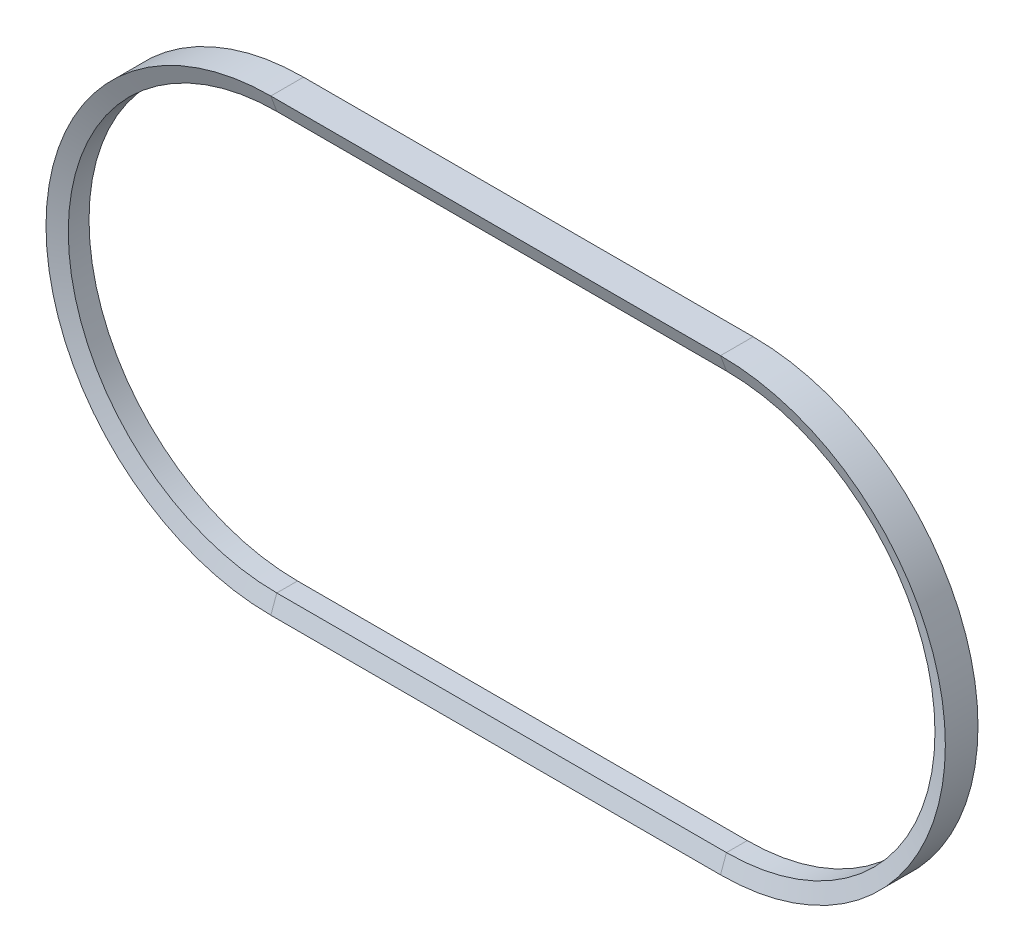
ISO-10303-21;
HEADER;
FILE_DESCRIPTION(('STEP AP214'),'2;1');
FILE_NAME('part.step','',(''),(''),'','','');
FILE_SCHEMA(('AUTOMOTIVE_DESIGN { 1 0 10303 214 1 1 1 1 }'));
ENDSEC;
DATA;
#1=APPLICATION_CONTEXT('core data for automotive mechanical design processes');
#2=APPLICATION_PROTOCOL_DEFINITION('international standard','automotive_design',2000,#1);
#3=PRODUCT_CONTEXT('',#1,'mechanical');
#4=PRODUCT('Part','Part','',(#3));
#5=PRODUCT_RELATED_PRODUCT_CATEGORY('part','',(#4));
#6=PRODUCT_DEFINITION_FORMATION('','',#4);
#7=PRODUCT_DEFINITION_CONTEXT('part definition',#1,'design');
#8=PRODUCT_DEFINITION('design','',#6,#7);
#9=PRODUCT_DEFINITION_SHAPE('','',#8);
#10=(LENGTH_UNIT() NAMED_UNIT(*) SI_UNIT(.MILLI.,.METRE.));
#11=(NAMED_UNIT(*) PLANE_ANGLE_UNIT() SI_UNIT($,.RADIAN.));
#12=(NAMED_UNIT(*) SI_UNIT($,.STERADIAN.) SOLID_ANGLE_UNIT());
#13=UNCERTAINTY_MEASURE_WITH_UNIT(LENGTH_MEASURE(1.E-05),#10,'distance_accuracy_value','');
#14=(GEOMETRIC_REPRESENTATION_CONTEXT(3) GLOBAL_UNCERTAINTY_ASSIGNED_CONTEXT((#13)) GLOBAL_UNIT_ASSIGNED_CONTEXT((#10,
#11,#12)) REPRESENTATION_CONTEXT('',''));
#15=CARTESIAN_POINT('',(0.,0.,0.));
#16=DIRECTION('',(0.,0.,1.));
#17=DIRECTION('',(1.,0.,0.));
#18=AXIS2_PLACEMENT_3D('',#15,#16,#17);
#19=CARTESIAN_POINT('',(0.,41.9908799755386,-3.048));
#20=DIRECTION('',(0.,-1.,0.));
#21=DIRECTION('',(1.,0.,0.));
#22=AXIS2_PLACEMENT_3D('',#19,#20,#21);
#23=PLANE('',#22);
#24=DIRECTION('',(-1.,0.,0.));
#25=VECTOR('',#24,1.);
#26=CARTESIAN_POINT('',(0.,41.9908799755386,3.048));
#27=LINE('',#26,#25);
#28=CARTESIAN_POINT('',(41.9908799755387,41.9908799755384,3.048));
#29=VERTEX_POINT('',#28);
#30=CARTESIAN_POINT('',(-41.9908799755387,41.9908799755386,3.048));
#31=VERTEX_POINT('',#30);
#32=EDGE_CURVE('E141',#29,#31,#27,.T.);
#33=ORIENTED_EDGE('',*,*,#32,.F.);
#34=DIRECTION('',(0.,0.,1.));
#35=VECTOR('',#34,1.);
#36=CARTESIAN_POINT('',(41.9908799755386,41.9908799755384,-3.048));
#37=LINE('',#36,#35);
#38=CARTESIAN_POINT('',(41.9908799755387,41.9908799755384,-3.048));
#39=VERTEX_POINT('',#38);
#40=EDGE_CURVE('E130',#39,#29,#37,.T.);
#41=ORIENTED_EDGE('',*,*,#40,.F.);
#42=DIRECTION('',(-1.,0.,0.));
#43=VECTOR('',#42,1.);
#44=CARTESIAN_POINT('',(0.,41.9908799755386,-3.048));
#45=LINE('',#44,#43);
#46=CARTESIAN_POINT('',(-41.9908799755387,41.9908799755386,-3.048));
#47=VERTEX_POINT('',#46);
#48=EDGE_CURVE('E126',#39,#47,#45,.T.);
#49=ORIENTED_EDGE('',*,*,#48,.T.);
#50=DIRECTION('',(0.,0.,1.));
#51=VECTOR('',#50,1.);
#52=CARTESIAN_POINT('',(-41.9908799755387,41.9908799755386,-3.048));
#53=LINE('',#52,#51);
#54=EDGE_CURVE('E128',#47,#31,#53,.T.);
#55=ORIENTED_EDGE('',*,*,#54,.T.);
#56=EDGE_LOOP('',(#33,#41,#49,#55));
#57=FACE_BOUND('',#56,.T.);
#58=ADVANCED_FACE('F32',(#57),#23,.F.);
#59=CARTESIAN_POINT('',(0.,41.9908799755386,3.048));
#60=DIRECTION('',(0.,0.34202014332567,-0.939692620785908));
#61=DIRECTION('',(0.,0.939692620785908,0.34202014332567));
#62=AXIS2_PLACEMENT_3D('',#59,#60,#61);
#63=PLANE('',#62);
#64=DIRECTION('',(-1.,0.,0.));
#65=VECTOR('',#64,1.);
#66=CARTESIAN_POINT('',(0.,38.9428799755386,1.93861872595661));
#67=LINE('',#66,#65);
#68=CARTESIAN_POINT('',(41.9908799755387,38.9428799755384,1.93861872595661));
#69=VERTEX_POINT('',#68);
#70=CARTESIAN_POINT('',(-41.9908799755387,38.9428799755386,1.93861872595661));
#71=VERTEX_POINT('',#70);
#72=EDGE_CURVE('E56',#69,#71,#67,.T.);
#73=ORIENTED_EDGE('',*,*,#72,.F.);
#74=DIRECTION('',(0.,-0.939692620785908,-0.34202014332567));
#75=VECTOR('',#74,1.);
#76=CARTESIAN_POINT('',(41.9908799755386,41.9908799755384,3.048));
#77=LINE('',#76,#75);
#78=EDGE_CURVE('E168',#29,#69,#77,.T.);
#79=ORIENTED_EDGE('',*,*,#78,.F.);
#80=ORIENTED_EDGE('',*,*,#32,.T.);
#81=DIRECTION('',(0.,-0.939692620785908,-0.34202014332567));
#82=VECTOR('',#81,1.);
#83=CARTESIAN_POINT('',(-41.9908799755387,41.9908799755386,3.048));
#84=LINE('',#83,#82);
#85=EDGE_CURVE('E171',#31,#71,#84,.T.);
#86=ORIENTED_EDGE('',*,*,#85,.T.);
#87=EDGE_LOOP('',(#73,#79,#80,#86));
#88=FACE_BOUND('',#87,.T.);
#89=ADVANCED_FACE('F213',(#88),#63,.F.);
#90=CARTESIAN_POINT('',(0.,38.9428799755386,1.93861872595661));
#91=DIRECTION('',(0.,1.,0.));
#92=DIRECTION('',(-1.,0.,0.));
#93=AXIS2_PLACEMENT_3D('',#90,#91,#92);
#94=PLANE('',#93);
#95=DIRECTION('',(-1.,0.,0.));
#96=VECTOR('',#95,1.);
#97=CARTESIAN_POINT('',(0.,38.9428799755386,-1.93861872595661));
#98=LINE('',#97,#96);
#99=CARTESIAN_POINT('',(41.9908799755387,38.9428799755384,-1.93861872595661));
#100=VERTEX_POINT('',#99);
#101=CARTESIAN_POINT('',(-41.9908799755387,38.9428799755386,-1.93861872595661));
#102=VERTEX_POINT('',#101);
#103=EDGE_CURVE('E47',#100,#102,#98,.T.);
#104=ORIENTED_EDGE('',*,*,#103,.F.);
#105=DIRECTION('',(0.,0.,-1.));
#106=VECTOR('',#105,1.);
#107=CARTESIAN_POINT('',(41.9908799755386,38.9428799755384,1.93861872595661));
#108=LINE('',#107,#106);
#109=EDGE_CURVE('E186',#69,#100,#108,.T.);
#110=ORIENTED_EDGE('',*,*,#109,.F.);
#111=ORIENTED_EDGE('',*,*,#72,.T.);
#112=DIRECTION('',(0.,0.,-1.));
#113=VECTOR('',#112,1.);
#114=CARTESIAN_POINT('',(-41.9908799755387,38.9428799755386,1.93861872595661));
#115=LINE('',#114,#113);
#116=EDGE_CURVE('E174',#71,#102,#115,.T.);
#117=ORIENTED_EDGE('',*,*,#116,.T.);
#118=EDGE_LOOP('',(#104,#110,#111,#117));
#119=FACE_BOUND('',#118,.T.);
#120=ADVANCED_FACE('F212',(#119),#94,.F.);
#121=CARTESIAN_POINT('',(0.,41.9908799755386,-3.048));
#122=DIRECTION('',(0.,0.34202014332567,0.939692620785908));
#123=DIRECTION('',(0.,-0.939692620785908,0.34202014332567));
#124=AXIS2_PLACEMENT_3D('',#121,#122,#123);
#125=PLANE('',#124);
#126=DIRECTION('',(0.,0.939692620785908,-0.34202014332567));
#127=VECTOR('',#126,1.);
#128=CARTESIAN_POINT('',(-41.9908799755387,41.9908799755386,-3.048));
#129=LINE('',#128,#127);
#130=EDGE_CURVE('E144',#102,#47,#129,.T.);
#131=ORIENTED_EDGE('',*,*,#130,.T.);
#132=ORIENTED_EDGE('',*,*,#48,.F.);
#133=DIRECTION('',(0.,0.939692620785908,-0.34202014332567));
#134=VECTOR('',#133,1.);
#135=CARTESIAN_POINT('',(41.9908799755386,41.9908799755384,-3.048));
#136=LINE('',#135,#134);
#137=EDGE_CURVE('E11',#100,#39,#136,.T.);
#138=ORIENTED_EDGE('',*,*,#137,.F.);
#139=ORIENTED_EDGE('',*,*,#103,.T.);
#140=EDGE_LOOP('',(#131,#132,#138,#139));
#141=FACE_BOUND('',#140,.T.);
#142=ADVANCED_FACE('F145',(#141),#125,.F.);
#143=CARTESIAN_POINT('',(-41.9908799755387,0.,0.));
#144=DIRECTION('',(0.,0.,1.));
#145=DIRECTION('',(1.,0.,0.));
#146=AXIS2_PLACEMENT_3D('',#143,#144,#145);
#147=CYLINDRICAL_SURFACE('',#146,41.9908799755386);
#148=CARTESIAN_POINT('',(-41.9908799755387,0.,3.048));
#149=DIRECTION('',(0.,0.,1.));
#150=DIRECTION('',(0.,1.,0.));
#151=AXIS2_PLACEMENT_3D('',#148,#149,#150);
#152=CIRCLE('',#151,41.9908799755386);
#153=CARTESIAN_POINT('',(-41.9908799755387,-41.9908799755387,3.048));
#154=VERTEX_POINT('',#153);
#155=EDGE_CURVE('E114',#31,#154,#152,.T.);
#156=ORIENTED_EDGE('',*,*,#155,.F.);
#157=ORIENTED_EDGE('',*,*,#54,.F.);
#158=CARTESIAN_POINT('',(-41.9908799755387,0.,-3.048));
#159=DIRECTION('',(0.,0.,1.));
#160=DIRECTION('',(0.,1.,0.));
#161=AXIS2_PLACEMENT_3D('',#158,#159,#160);
#162=CIRCLE('',#161,41.9908799755386);
#163=CARTESIAN_POINT('',(-41.9908799755387,-41.9908799755387,-3.048));
#164=VERTEX_POINT('',#163);
#165=EDGE_CURVE('E139',#47,#164,#162,.T.);
#166=ORIENTED_EDGE('',*,*,#165,.T.);
#167=DIRECTION('',(0.,0.,1.));
#168=VECTOR('',#167,1.);
#169=CARTESIAN_POINT('',(-41.9908799755387,-41.9908799755387,-3.048));
#170=LINE('',#169,#168);
#171=EDGE_CURVE('E152',#164,#154,#170,.T.);
#172=ORIENTED_EDGE('',*,*,#171,.T.);
#173=EDGE_LOOP('',(#156,#157,#166,#172));
#174=FACE_BOUND('',#173,.T.);
#175=ADVANCED_FACE('F137',(#174),#147,.T.);
#176=CARTESIAN_POINT('',(-41.9908799755387,0.,3.048));
#177=DIRECTION('',(0.,0.,1.));
#178=DIRECTION('',(1.,0.,0.));
#179=AXIS2_PLACEMENT_3D('',#176,#177,#178);
#180=CONICAL_SURFACE('',#179,41.9908799755386,1.22173047639603);
#181=CARTESIAN_POINT('',(-41.9908799755387,0.,1.93861872595661));
#182=DIRECTION('',(0.,0.,1.));
#183=DIRECTION('',(0.,1.,0.));
#184=AXIS2_PLACEMENT_3D('',#181,#182,#183);
#185=CIRCLE('',#184,38.9428799755386);
#186=CARTESIAN_POINT('',(-41.9908799755387,-38.9428799755387,1.93861872595661));
#187=VERTEX_POINT('',#186);
#188=EDGE_CURVE('E108',#71,#187,#185,.T.);
#189=ORIENTED_EDGE('',*,*,#188,.F.);
#190=ORIENTED_EDGE('',*,*,#85,.F.);
#191=ORIENTED_EDGE('',*,*,#155,.T.);
#192=DIRECTION('',(0.,0.939692620785908,-0.34202014332567));
#193=VECTOR('',#192,1.);
#194=CARTESIAN_POINT('',(-41.9908799755387,-41.9908799755387,3.048));
#195=LINE('',#194,#193);
#196=EDGE_CURVE('E175',#154,#187,#195,.T.);
#197=ORIENTED_EDGE('',*,*,#196,.T.);
#198=EDGE_LOOP('',(#189,#190,#191,#197));
#199=FACE_BOUND('',#198,.T.);
#200=ADVANCED_FACE('F209',(#199),#180,.F.);
#201=CARTESIAN_POINT('',(-41.9908799755387,0.,0.));
#202=DIRECTION('',(0.,0.,1.));
#203=DIRECTION('',(1.,0.,0.));
#204=AXIS2_PLACEMENT_3D('',#201,#202,#203);
#205=CYLINDRICAL_SURFACE('',#204,38.9428799755386);
#206=CARTESIAN_POINT('',(-41.9908799755387,0.,-1.93861872595661));
#207=DIRECTION('',(0.,0.,1.));
#208=DIRECTION('',(0.,1.,0.));
#209=AXIS2_PLACEMENT_3D('',#206,#207,#208);
#210=CIRCLE('',#209,38.9428799755386);
#211=CARTESIAN_POINT('',(-41.9908799755387,-38.9428799755387,-1.93861872595661));
#212=VERTEX_POINT('',#211);
#213=EDGE_CURVE('E190',#102,#212,#210,.T.);
#214=ORIENTED_EDGE('',*,*,#213,.F.);
#215=ORIENTED_EDGE('',*,*,#116,.F.);
#216=ORIENTED_EDGE('',*,*,#188,.T.);
#217=DIRECTION('',(0.,0.,-1.));
#218=VECTOR('',#217,1.);
#219=CARTESIAN_POINT('',(-41.9908799755387,-38.9428799755387,1.93861872595661));
#220=LINE('',#219,#218);
#221=EDGE_CURVE('E178',#187,#212,#220,.T.);
#222=ORIENTED_EDGE('',*,*,#221,.T.);
#223=EDGE_LOOP('',(#214,#215,#216,#222));
#224=FACE_BOUND('',#223,.T.);
#225=ADVANCED_FACE('F211',(#224),#205,.F.);
#226=CARTESIAN_POINT('',(-41.9908799755387,0.,-1.93861872595661));
#227=DIRECTION('',(0.,0.,-1.));
#228=DIRECTION('',(-1.,0.,0.));
#229=AXIS2_PLACEMENT_3D('',#226,#227,#228);
#230=CONICAL_SURFACE('',#229,38.9428799755386,1.22173047639603);
#231=DIRECTION('',(0.,-0.939692620785908,-0.34202014332567));
#232=VECTOR('',#231,1.);
#233=CARTESIAN_POINT('',(-41.9908799755387,-41.9908799755387,-3.048));
#234=LINE('',#233,#232);
#235=EDGE_CURVE('E150',#212,#164,#234,.T.);
#236=ORIENTED_EDGE('',*,*,#235,.T.);
#237=ORIENTED_EDGE('',*,*,#165,.F.);
#238=ORIENTED_EDGE('',*,*,#130,.F.);
#239=ORIENTED_EDGE('',*,*,#213,.T.);
#240=EDGE_LOOP('',(#236,#237,#238,#239));
#241=FACE_BOUND('',#240,.T.);
#242=ADVANCED_FACE('F149',(#241),#230,.F.);
#243=CARTESIAN_POINT('',(-41.9908799755387,-41.9908799755387,-3.048));
#244=DIRECTION('',(0.,1.,0.));
#245=DIRECTION('',(-1.,0.,0.));
#246=AXIS2_PLACEMENT_3D('',#243,#244,#245);
#247=PLANE('',#246);
#248=DIRECTION('',(1.,0.,0.));
#249=VECTOR('',#248,1.);
#250=CARTESIAN_POINT('',(-41.9908799755387,-41.9908799755387,3.048));
#251=LINE('',#250,#249);
#252=CARTESIAN_POINT('',(41.9908799755387,-41.9908799755386,3.048));
#253=VERTEX_POINT('',#252);
#254=EDGE_CURVE('E95',#154,#253,#251,.T.);
#255=ORIENTED_EDGE('',*,*,#254,.F.);
#256=ORIENTED_EDGE('',*,*,#171,.F.);
#257=DIRECTION('',(1.,0.,0.));
#258=VECTOR('',#257,1.);
#259=CARTESIAN_POINT('',(-41.9908799755387,-41.9908799755387,-3.048));
#260=LINE('',#259,#258);
#261=CARTESIAN_POINT('',(41.9908799755387,-41.9908799755386,-3.048));
#262=VERTEX_POINT('',#261);
#263=EDGE_CURVE('E161',#164,#262,#260,.T.);
#264=ORIENTED_EDGE('',*,*,#263,.T.);
#265=DIRECTION('',(0.,0.,1.));
#266=VECTOR('',#265,1.);
#267=CARTESIAN_POINT('',(41.9908799755387,-41.9908799755386,-3.048));
#268=LINE('',#267,#266);
#269=EDGE_CURVE('E157',#262,#253,#268,.T.);
#270=ORIENTED_EDGE('',*,*,#269,.T.);
#271=EDGE_LOOP('',(#255,#256,#264,#270));
#272=FACE_BOUND('',#271,.T.);
#273=ADVANCED_FACE('F207',(#272),#247,.F.);
#274=CARTESIAN_POINT('',(-41.9908799755387,-41.9908799755387,3.048));
#275=DIRECTION('',(0.,-0.34202014332567,-0.939692620785908));
#276=DIRECTION('',(0.,0.939692620785908,-0.34202014332567));
#277=AXIS2_PLACEMENT_3D('',#274,#275,#276);
#278=PLANE('',#277);
#279=DIRECTION('',(1.,0.,0.));
#280=VECTOR('',#279,1.);
#281=CARTESIAN_POINT('',(-41.9908799755387,-38.9428799755387,1.93861872595661));
#282=LINE('',#281,#280);
#283=CARTESIAN_POINT('',(41.9908799755387,-38.9428799755386,1.93861872595661));
#284=VERTEX_POINT('',#283);
#285=EDGE_CURVE('E88',#187,#284,#282,.T.);
#286=ORIENTED_EDGE('',*,*,#285,.F.);
#287=ORIENTED_EDGE('',*,*,#196,.F.);
#288=ORIENTED_EDGE('',*,*,#254,.T.);
#289=DIRECTION('',(0.,0.939692620785908,-0.34202014332567));
#290=VECTOR('',#289,1.);
#291=CARTESIAN_POINT('',(41.9908799755387,-41.9908799755386,3.048));
#292=LINE('',#291,#290);
#293=EDGE_CURVE('E159',#253,#284,#292,.T.);
#294=ORIENTED_EDGE('',*,*,#293,.T.);
#295=EDGE_LOOP('',(#286,#287,#288,#294));
#296=FACE_BOUND('',#295,.T.);
#297=ADVANCED_FACE('F208',(#296),#278,.F.);
#298=CARTESIAN_POINT('',(-41.9908799755387,-38.9428799755387,1.93861872595661));
#299=DIRECTION('',(0.,-1.,0.));
#300=DIRECTION('',(1.,0.,0.));
#301=AXIS2_PLACEMENT_3D('',#298,#299,#300);
#302=PLANE('',#301);
#303=DIRECTION('',(1.,0.,0.));
#304=VECTOR('',#303,1.);
#305=CARTESIAN_POINT('',(-41.9908799755387,-38.9428799755387,-1.93861872595661));
#306=LINE('',#305,#304);
#307=CARTESIAN_POINT('',(41.9908799755387,-38.9428799755386,-1.93861872595661));
#308=VERTEX_POINT('',#307);
#309=EDGE_CURVE('E79',#212,#308,#306,.T.);
#310=ORIENTED_EDGE('',*,*,#309,.F.);
#311=ORIENTED_EDGE('',*,*,#221,.F.);
#312=ORIENTED_EDGE('',*,*,#285,.T.);
#313=DIRECTION('',(0.,0.,-1.));
#314=VECTOR('',#313,1.);
#315=CARTESIAN_POINT('',(41.9908799755387,-38.9428799755386,1.93861872595661));
#316=LINE('',#315,#314);
#317=EDGE_CURVE('E180',#284,#308,#316,.T.);
#318=ORIENTED_EDGE('',*,*,#317,.T.);
#319=EDGE_LOOP('',(#310,#311,#312,#318));
#320=FACE_BOUND('',#319,.T.);
#321=ADVANCED_FACE('F222',(#320),#302,.F.);
#322=CARTESIAN_POINT('',(-41.9908799755387,-41.9908799755387,-3.048));
#323=DIRECTION('',(0.,-0.34202014332567,0.939692620785908));
#324=DIRECTION('',(0.,-0.939692620785908,-0.34202014332567));
#325=AXIS2_PLACEMENT_3D('',#322,#323,#324);
#326=PLANE('',#325);
#327=DIRECTION('',(0.,-0.939692620785908,-0.34202014332567));
#328=VECTOR('',#327,1.);
#329=CARTESIAN_POINT('',(41.9908799755387,-41.9908799755386,-3.048));
#330=LINE('',#329,#328);
#331=EDGE_CURVE('E170',#308,#262,#330,.T.);
#332=ORIENTED_EDGE('',*,*,#331,.T.);
#333=ORIENTED_EDGE('',*,*,#263,.F.);
#334=ORIENTED_EDGE('',*,*,#235,.F.);
#335=ORIENTED_EDGE('',*,*,#309,.T.);
#336=EDGE_LOOP('',(#332,#333,#334,#335));
#337=FACE_BOUND('',#336,.T.);
#338=ADVANCED_FACE('F199',(#337),#326,.F.);
#339=CARTESIAN_POINT('',(41.9908799755387,-2.01735605057336E-13,0.));
#340=DIRECTION('',(0.,0.,1.));
#341=DIRECTION('',(1.,0.,0.));
#342=AXIS2_PLACEMENT_3D('',#339,#340,#341);
#343=CYLINDRICAL_SURFACE('',#342,41.9908799755386);
#344=CARTESIAN_POINT('',(41.9908799755387,-2.01735605057336E-13,3.048));
#345=DIRECTION('',(0.,0.,1.));
#346=DIRECTION('',(0.,-1.,0.));
#347=AXIS2_PLACEMENT_3D('',#344,#345,#346);
#348=CIRCLE('',#347,41.9908799755386);
#349=EDGE_CURVE('E164',#253,#29,#348,.T.);
#350=ORIENTED_EDGE('',*,*,#349,.F.);
#351=ORIENTED_EDGE('',*,*,#269,.F.);
#352=CARTESIAN_POINT('',(41.9908799755387,-2.01735605057336E-13,-3.048));
#353=DIRECTION('',(0.,0.,1.));
#354=DIRECTION('',(0.,-1.,0.));
#355=AXIS2_PLACEMENT_3D('',#352,#353,#354);
#356=CIRCLE('',#355,41.9908799755386);
#357=EDGE_CURVE('E165',#262,#39,#356,.T.);
#358=ORIENTED_EDGE('',*,*,#357,.T.);
#359=ORIENTED_EDGE('',*,*,#40,.T.);
#360=EDGE_LOOP('',(#350,#351,#358,#359));
#361=FACE_BOUND('',#360,.T.);
#362=ADVANCED_FACE('F204',(#361),#343,.T.);
#363=CARTESIAN_POINT('',(41.9908799755387,-2.01735605057336E-13,3.048));
#364=DIRECTION('',(0.,0.,1.));
#365=DIRECTION('',(1.,0.,0.));
#366=AXIS2_PLACEMENT_3D('',#363,#364,#365);
#367=CONICAL_SURFACE('',#366,41.9908799755386,1.22173047639603);
#368=CARTESIAN_POINT('',(41.9908799755387,-2.01735605057336E-13,1.93861872595661));
#369=DIRECTION('',(0.,0.,1.));
#370=DIRECTION('',(0.,-1.,0.));
#371=AXIS2_PLACEMENT_3D('',#368,#369,#370);
#372=CIRCLE('',#371,38.9428799755386);
#373=EDGE_CURVE('E184',#284,#69,#372,.T.);
#374=ORIENTED_EDGE('',*,*,#373,.F.);
#375=ORIENTED_EDGE('',*,*,#293,.F.);
#376=ORIENTED_EDGE('',*,*,#349,.T.);
#377=ORIENTED_EDGE('',*,*,#78,.T.);
#378=EDGE_LOOP('',(#374,#375,#376,#377));
#379=FACE_BOUND('',#378,.T.);
#380=ADVANCED_FACE('F217',(#379),#367,.F.);
#381=CARTESIAN_POINT('',(41.9908799755387,-2.01735605057336E-13,0.));
#382=DIRECTION('',(0.,0.,1.));
#383=DIRECTION('',(1.,0.,0.));
#384=AXIS2_PLACEMENT_3D('',#381,#382,#383);
#385=CYLINDRICAL_SURFACE('',#384,38.9428799755386);
#386=CARTESIAN_POINT('',(41.9908799755387,-2.01735605057336E-13,-1.93861872595661));
#387=DIRECTION('',(0.,0.,1.));
#388=DIRECTION('',(0.,-1.,0.));
#389=AXIS2_PLACEMENT_3D('',#386,#387,#388);
#390=CIRCLE('',#389,38.9428799755386);
#391=EDGE_CURVE('E40',#308,#100,#390,.T.);
#392=ORIENTED_EDGE('',*,*,#391,.F.);
#393=ORIENTED_EDGE('',*,*,#317,.F.);
#394=ORIENTED_EDGE('',*,*,#373,.T.);
#395=ORIENTED_EDGE('',*,*,#109,.T.);
#396=EDGE_LOOP('',(#392,#393,#394,#395));
#397=FACE_BOUND('',#396,.T.);
#398=ADVANCED_FACE('F221',(#397),#385,.F.);
#399=CARTESIAN_POINT('',(41.9908799755387,-2.01735605057336E-13,-1.93861872595661));
#400=DIRECTION('',(0.,0.,-1.));
#401=DIRECTION('',(-1.,0.,0.));
#402=AXIS2_PLACEMENT_3D('',#399,#400,#401);
#403=CONICAL_SURFACE('',#402,38.9428799755386,1.22173047639603);
#404=ORIENTED_EDGE('',*,*,#137,.T.);
#405=ORIENTED_EDGE('',*,*,#357,.F.);
#406=ORIENTED_EDGE('',*,*,#331,.F.);
#407=ORIENTED_EDGE('',*,*,#391,.T.);
#408=EDGE_LOOP('',(#404,#405,#406,#407));
#409=FACE_BOUND('',#408,.T.);
#410=ADVANCED_FACE('F34',(#409),#403,.F.);
#411=CLOSED_SHELL('',(#58,#89,#120,#142,#175,#200,#225,#242,#273,#297,#321,#338,#362,#380,#398,#410));
#412=MANIFOLD_SOLID_BREP('B2',#411);
#413=ADVANCED_BREP_SHAPE_REPRESENTATION('',(#18,#412),#14);
#414=SHAPE_DEFINITION_REPRESENTATION(#9,#413);
ENDSEC;
END-ISO-10303-21;
